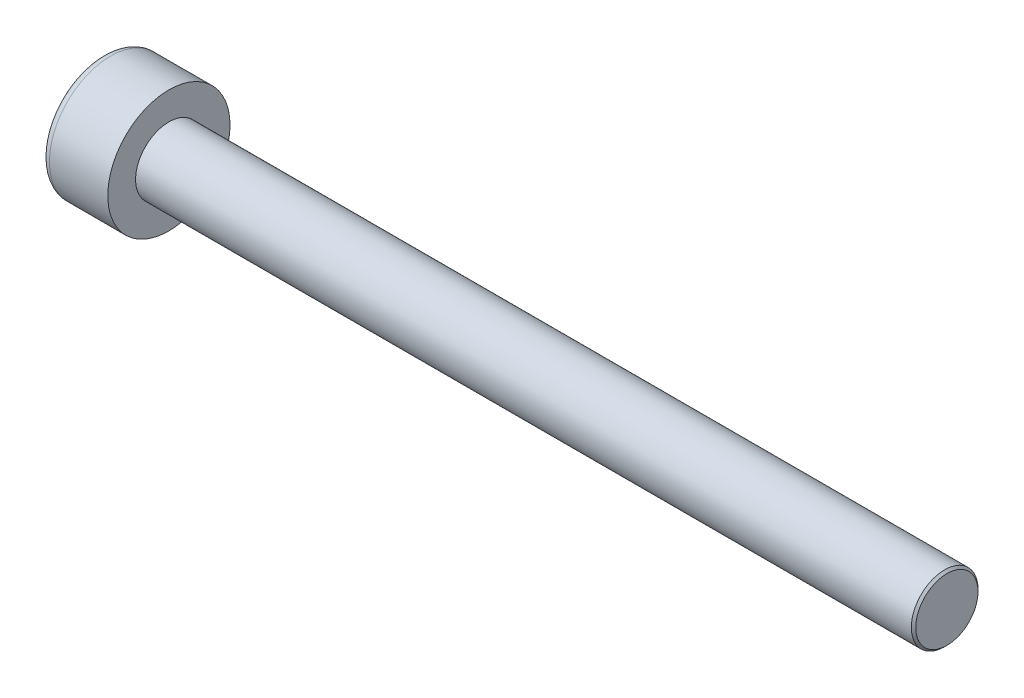
ISO-10303-21;
HEADER;
FILE_DESCRIPTION(('STEP AP214'),'2;1');
FILE_NAME('part.step','',(''),(''),'','','');
FILE_SCHEMA(('AUTOMOTIVE_DESIGN { 1 0 10303 214 1 1 1 1 }'));
ENDSEC;
DATA;
#1=APPLICATION_CONTEXT('core data for automotive mechanical design processes');
#2=APPLICATION_PROTOCOL_DEFINITION('international standard','automotive_design',2000,#1);
#3=PRODUCT_CONTEXT('',#1,'mechanical');
#4=PRODUCT('Part','Part','',(#3));
#5=PRODUCT_RELATED_PRODUCT_CATEGORY('part','',(#4));
#6=PRODUCT_DEFINITION_FORMATION('','',#4);
#7=PRODUCT_DEFINITION_CONTEXT('part definition',#1,'design');
#8=PRODUCT_DEFINITION('design','',#6,#7);
#9=PRODUCT_DEFINITION_SHAPE('','',#8);
#10=(LENGTH_UNIT() NAMED_UNIT(*) SI_UNIT(.MILLI.,.METRE.));
#11=(NAMED_UNIT(*) PLANE_ANGLE_UNIT() SI_UNIT($,.RADIAN.));
#12=(NAMED_UNIT(*) SI_UNIT($,.STERADIAN.) SOLID_ANGLE_UNIT());
#13=UNCERTAINTY_MEASURE_WITH_UNIT(LENGTH_MEASURE(1.E-05),#10,'distance_accuracy_value','');
#14=(GEOMETRIC_REPRESENTATION_CONTEXT(3) GLOBAL_UNCERTAINTY_ASSIGNED_CONTEXT((#13)) GLOBAL_UNIT_ASSIGNED_CONTEXT((#10,
#11,#12)) REPRESENTATION_CONTEXT('',''));
#15=CARTESIAN_POINT('',(0.,0.,0.));
#16=DIRECTION('',(0.,0.,1.));
#17=DIRECTION('',(1.,0.,0.));
#18=AXIS2_PLACEMENT_3D('',#15,#16,#17);
#19=CARTESIAN_POINT('',(1.3,-1.25,0.721687836487031));
#20=DIRECTION('',(0.,1.,0.));
#21=DIRECTION('',(1.,0.,0.));
#22=AXIS2_PLACEMENT_3D('',#19,#20,#21);
#23=PLANE('',#22);
#24=DIRECTION('',(0.,0.,-1.));
#25=VECTOR('',#24,1.);
#26=CARTESIAN_POINT('',(0.,-1.25,0.721687836487031));
#27=LINE('',#26,#25);
#28=CARTESIAN_POINT('',(0.,-1.25,0.721687836487031));
#29=VERTEX_POINT('',#28);
#30=CARTESIAN_POINT('',(0.,-1.25,-0.721687836487035));
#31=VERTEX_POINT('',#30);
#32=EDGE_CURVE('E150',#29,#31,#27,.T.);
#33=ORIENTED_EDGE('',*,*,#32,.F.);
#34=DIRECTION('',(-1.,0.,0.));
#35=VECTOR('',#34,1.);
#36=CARTESIAN_POINT('',(1.3,-1.25,0.721687836487031));
#37=LINE('',#36,#35);
#38=CARTESIAN_POINT('',(1.3,-1.25,0.721687836487031));
#39=VERTEX_POINT('',#38);
#40=EDGE_CURVE('E11',#39,#29,#37,.T.);
#41=ORIENTED_EDGE('',*,*,#40,.F.);
#42=DIRECTION('',(0.,0.,-1.));
#43=VECTOR('',#42,1.);
#44=CARTESIAN_POINT('',(1.3,-1.25,0.721687836487031));
#45=LINE('',#44,#43);
#46=CARTESIAN_POINT('',(1.3,-1.25,0.));
#47=VERTEX_POINT('',#46);
#48=EDGE_CURVE('E173',#39,#47,#45,.T.);
#49=ORIENTED_EDGE('',*,*,#48,.T.);
#50=DIRECTION('',(0.,0.,-1.));
#51=VECTOR('',#50,1.);
#52=CARTESIAN_POINT('',(1.3,-1.25,0.721687836487031));
#53=LINE('',#52,#51);
#54=CARTESIAN_POINT('',(1.3,-1.25,-0.721687836487035));
#55=VERTEX_POINT('',#54);
#56=EDGE_CURVE('E21',#47,#55,#53,.T.);
#57=ORIENTED_EDGE('',*,*,#56,.T.);
#58=DIRECTION('',(-1.,0.,0.));
#59=VECTOR('',#58,1.);
#60=CARTESIAN_POINT('',(1.3,-1.25,-0.721687836487035));
#61=LINE('',#60,#59);
#62=EDGE_CURVE('E135',#55,#31,#61,.T.);
#63=ORIENTED_EDGE('',*,*,#62,.T.);
#64=EDGE_LOOP('',(#33,#41,#49,#57,#63));
#65=FACE_BOUND('',#64,.T.);
#66=ADVANCED_FACE('F17',(#65),#23,.T.);
#67=CARTESIAN_POINT('',(1.3,0.,1.44337567297406));
#68=DIRECTION('',(0.,0.5,-0.866025403784439));
#69=DIRECTION('',(-1.,0.,0.));
#70=AXIS2_PLACEMENT_3D('',#67,#68,#69);
#71=PLANE('',#70);
#72=DIRECTION('',(0.,-0.866025403784439,-0.5));
#73=VECTOR('',#72,1.);
#74=CARTESIAN_POINT('',(0.,0.,1.44337567297406));
#75=LINE('',#74,#73);
#76=CARTESIAN_POINT('',(0.,0.,1.44337567297406));
#77=VERTEX_POINT('',#76);
#78=EDGE_CURVE('E169',#77,#29,#75,.T.);
#79=ORIENTED_EDGE('',*,*,#78,.F.);
#80=DIRECTION('',(-1.,0.,0.));
#81=VECTOR('',#80,1.);
#82=CARTESIAN_POINT('',(1.3,0.,1.44337567297406));
#83=LINE('',#82,#81);
#84=CARTESIAN_POINT('',(1.3,0.,1.44337567297406));
#85=VERTEX_POINT('',#84);
#86=EDGE_CURVE('E28',#85,#77,#83,.T.);
#87=ORIENTED_EDGE('',*,*,#86,.F.);
#88=DIRECTION('',(0.,-0.866025403784439,-0.5));
#89=VECTOR('',#88,1.);
#90=CARTESIAN_POINT('',(1.3,0.,1.44337567297406));
#91=LINE('',#90,#89);
#92=CARTESIAN_POINT('',(1.3,-0.625,1.08253175473055));
#93=VERTEX_POINT('',#92);
#94=EDGE_CURVE('E152',#85,#93,#91,.T.);
#95=ORIENTED_EDGE('',*,*,#94,.T.);
#96=DIRECTION('',(0.,-0.866025403784439,-0.5));
#97=VECTOR('',#96,1.);
#98=CARTESIAN_POINT('',(1.3,0.,1.44337567297406));
#99=LINE('',#98,#97);
#100=EDGE_CURVE('E177',#93,#39,#99,.T.);
#101=ORIENTED_EDGE('',*,*,#100,.T.);
#102=ORIENTED_EDGE('',*,*,#40,.T.);
#103=EDGE_LOOP('',(#79,#87,#95,#101,#102));
#104=FACE_BOUND('',#103,.T.);
#105=ADVANCED_FACE('F260',(#104),#71,.T.);
#106=CARTESIAN_POINT('',(1.3,1.25,0.721687836487032));
#107=DIRECTION('',(0.,-0.5,-0.866025403784439));
#108=DIRECTION('',(0.,-0.866025403784439,0.5));
#109=AXIS2_PLACEMENT_3D('',#106,#107,#108);
#110=PLANE('',#109);
#111=DIRECTION('',(0.,-0.866025403784439,0.5));
#112=VECTOR('',#111,1.);
#113=CARTESIAN_POINT('',(0.,1.25,0.721687836487032));
#114=LINE('',#113,#112);
#115=CARTESIAN_POINT('',(0.,1.25,0.721687836487032));
#116=VERTEX_POINT('',#115);
#117=EDGE_CURVE('E172',#116,#77,#114,.T.);
#118=ORIENTED_EDGE('',*,*,#117,.F.);
#119=DIRECTION('',(-1.,0.,0.));
#120=VECTOR('',#119,1.);
#121=CARTESIAN_POINT('',(1.3,1.25,0.721687836487032));
#122=LINE('',#121,#120);
#123=CARTESIAN_POINT('',(1.3,1.25,0.721687836487032));
#124=VERTEX_POINT('',#123);
#125=EDGE_CURVE('E211',#124,#116,#122,.T.);
#126=ORIENTED_EDGE('',*,*,#125,.F.);
#127=DIRECTION('',(0.,-0.866025403784439,0.5));
#128=VECTOR('',#127,1.);
#129=CARTESIAN_POINT('',(1.3,1.25,0.721687836487032));
#130=LINE('',#129,#128);
#131=CARTESIAN_POINT('',(1.3,0.625,1.08253175473055));
#132=VERTEX_POINT('',#131);
#133=EDGE_CURVE('E232',#124,#132,#130,.T.);
#134=ORIENTED_EDGE('',*,*,#133,.T.);
#135=DIRECTION('',(0.,-0.866025403784439,0.5));
#136=VECTOR('',#135,1.);
#137=CARTESIAN_POINT('',(1.3,1.25,0.721687836487032));
#138=LINE('',#137,#136);
#139=EDGE_CURVE('E159',#132,#85,#138,.T.);
#140=ORIENTED_EDGE('',*,*,#139,.T.);
#141=ORIENTED_EDGE('',*,*,#86,.T.);
#142=EDGE_LOOP('',(#118,#126,#134,#140,#141));
#143=FACE_BOUND('',#142,.T.);
#144=ADVANCED_FACE('F266',(#143),#110,.T.);
#145=CARTESIAN_POINT('',(1.3,1.25,-0.721687836487031));
#146=DIRECTION('',(0.,-1.,0.));
#147=DIRECTION('',(0.,0.,-1.));
#148=AXIS2_PLACEMENT_3D('',#145,#146,#147);
#149=PLANE('',#148);
#150=DIRECTION('',(0.,0.,1.));
#151=VECTOR('',#150,1.);
#152=CARTESIAN_POINT('',(0.,1.25,-0.721687836487031));
#153=LINE('',#152,#151);
#154=CARTESIAN_POINT('',(0.,1.25,-0.721687836487031));
#155=VERTEX_POINT('',#154);
#156=EDGE_CURVE('E144',#155,#116,#153,.T.);
#157=ORIENTED_EDGE('',*,*,#156,.F.);
#158=DIRECTION('',(-1.,0.,0.));
#159=VECTOR('',#158,1.);
#160=CARTESIAN_POINT('',(1.3,1.25,-0.721687836487031));
#161=LINE('',#160,#159);
#162=CARTESIAN_POINT('',(1.3,1.25,-0.721687836487031));
#163=VERTEX_POINT('',#162);
#164=EDGE_CURVE('E134',#163,#155,#161,.T.);
#165=ORIENTED_EDGE('',*,*,#164,.F.);
#166=DIRECTION('',(0.,0.,1.));
#167=VECTOR('',#166,1.);
#168=CARTESIAN_POINT('',(1.3,1.25,-0.721687836487031));
#169=LINE('',#168,#167);
#170=CARTESIAN_POINT('',(1.3,1.25,0.));
#171=VERTEX_POINT('',#170);
#172=EDGE_CURVE('E226',#163,#171,#169,.T.);
#173=ORIENTED_EDGE('',*,*,#172,.T.);
#174=DIRECTION('',(0.,0.,1.));
#175=VECTOR('',#174,1.);
#176=CARTESIAN_POINT('',(1.3,1.25,-0.721687836487031));
#177=LINE('',#176,#175);
#178=EDGE_CURVE('E113',#171,#124,#177,.T.);
#179=ORIENTED_EDGE('',*,*,#178,.T.);
#180=ORIENTED_EDGE('',*,*,#125,.T.);
#181=EDGE_LOOP('',(#157,#165,#173,#179,#180));
#182=FACE_BOUND('',#181,.T.);
#183=ADVANCED_FACE('F367',(#182),#149,.T.);
#184=CARTESIAN_POINT('',(1.3,0.,-1.44337567297406));
#185=DIRECTION('',(0.,-0.5,0.866025403784439));
#186=DIRECTION('',(-1.,0.,0.));
#187=AXIS2_PLACEMENT_3D('',#184,#185,#186);
#188=PLANE('',#187);
#189=DIRECTION('',(0.,0.866025403784439,0.5));
#190=VECTOR('',#189,1.);
#191=CARTESIAN_POINT('',(0.,0.,-1.44337567297406));
#192=LINE('',#191,#190);
#193=CARTESIAN_POINT('',(0.,0.,-1.44337567297406));
#194=VERTEX_POINT('',#193);
#195=EDGE_CURVE('E138',#194,#155,#192,.T.);
#196=ORIENTED_EDGE('',*,*,#195,.F.);
#197=DIRECTION('',(-1.,0.,0.));
#198=VECTOR('',#197,1.);
#199=CARTESIAN_POINT('',(1.3,0.,-1.44337567297406));
#200=LINE('',#199,#198);
#201=CARTESIAN_POINT('',(1.3,0.,-1.44337567297406));
#202=VERTEX_POINT('',#201);
#203=EDGE_CURVE('E122',#202,#194,#200,.T.);
#204=ORIENTED_EDGE('',*,*,#203,.F.);
#205=DIRECTION('',(0.,0.866025403784439,0.5));
#206=VECTOR('',#205,1.);
#207=CARTESIAN_POINT('',(1.3,0.,-1.44337567297406));
#208=LINE('',#207,#206);
#209=CARTESIAN_POINT('',(1.3,0.625,-1.08253175473055));
#210=VERTEX_POINT('',#209);
#211=EDGE_CURVE('E216',#202,#210,#208,.T.);
#212=ORIENTED_EDGE('',*,*,#211,.T.);
#213=DIRECTION('',(0.,0.866025403784439,0.5));
#214=VECTOR('',#213,1.);
#215=CARTESIAN_POINT('',(1.3,0.,-1.44337567297406));
#216=LINE('',#215,#214);
#217=EDGE_CURVE('E102',#210,#163,#216,.T.);
#218=ORIENTED_EDGE('',*,*,#217,.T.);
#219=ORIENTED_EDGE('',*,*,#164,.T.);
#220=EDGE_LOOP('',(#196,#204,#212,#218,#219));
#221=FACE_BOUND('',#220,.T.);
#222=ADVANCED_FACE('F139',(#221),#188,.T.);
#223=CARTESIAN_POINT('',(1.3,-1.25,-0.721687836487035));
#224=DIRECTION('',(0.,0.5,0.866025403784439));
#225=DIRECTION('',(1.,0.,0.));
#226=AXIS2_PLACEMENT_3D('',#223,#224,#225);
#227=PLANE('',#226);
#228=DIRECTION('',(0.,0.866025403784439,-0.5));
#229=VECTOR('',#228,1.);
#230=CARTESIAN_POINT('',(0.,-1.25,-0.721687836487035));
#231=LINE('',#230,#229);
#232=EDGE_CURVE('E127',#31,#194,#231,.T.);
#233=ORIENTED_EDGE('',*,*,#232,.F.);
#234=ORIENTED_EDGE('',*,*,#62,.F.);
#235=DIRECTION('',(0.,0.866025403784439,-0.5));
#236=VECTOR('',#235,1.);
#237=CARTESIAN_POINT('',(1.3,-1.25,-0.721687836487035));
#238=LINE('',#237,#236);
#239=CARTESIAN_POINT('',(1.3,-0.625,-1.08253175473055));
#240=VERTEX_POINT('',#239);
#241=EDGE_CURVE('E319',#55,#240,#238,.T.);
#242=ORIENTED_EDGE('',*,*,#241,.T.);
#243=DIRECTION('',(0.,0.866025403784439,-0.5));
#244=VECTOR('',#243,1.);
#245=CARTESIAN_POINT('',(1.3,-1.25,-0.721687836487035));
#246=LINE('',#245,#244);
#247=EDGE_CURVE('E130',#240,#202,#246,.T.);
#248=ORIENTED_EDGE('',*,*,#247,.T.);
#249=ORIENTED_EDGE('',*,*,#203,.T.);
#250=EDGE_LOOP('',(#233,#234,#242,#248,#249));
#251=FACE_BOUND('',#250,.T.);
#252=ADVANCED_FACE('F124',(#251),#227,.T.);
#253=CARTESIAN_POINT('',(38.,0.,0.));
#254=DIRECTION('',(1.,0.,0.));
#255=DIRECTION('',(0.,1.,0.));
#256=AXIS2_PLACEMENT_3D('',#253,#254,#255);
#257=PLANE('',#256);
#258=CARTESIAN_POINT('',(38.,0.,0.));
#259=DIRECTION('',(1.,0.,0.));
#260=DIRECTION('',(0.,0.,-1.));
#261=AXIS2_PLACEMENT_3D('',#258,#259,#260);
#262=CIRCLE('',#261,1.4);
#263=CARTESIAN_POINT('',(38.,0.,-1.4));
#264=VERTEX_POINT('',#263);
#265=EDGE_CURVE('E212',#264,#264,#262,.T.);
#266=ORIENTED_EDGE('',*,*,#265,.T.);
#267=EDGE_LOOP('',(#266));
#268=FACE_BOUND('',#267,.T.);
#269=ADVANCED_FACE('F19',(#268),#257,.T.);
#270=CARTESIAN_POINT('',(3.,0.,0.));
#271=DIRECTION('',(1.,0.,0.));
#272=DIRECTION('',(0.,1.,0.));
#273=AXIS2_PLACEMENT_3D('',#270,#271,#272);
#274=PLANE('',#273);
#275=CARTESIAN_POINT('',(3.,0.,0.));
#276=DIRECTION('',(1.,0.,0.));
#277=DIRECTION('',(0.,0.,-1.));
#278=AXIS2_PLACEMENT_3D('',#275,#276,#277);
#279=CIRCLE('',#278,1.5);
#280=CARTESIAN_POINT('',(3.,0.,-1.5));
#281=VERTEX_POINT('',#280);
#282=EDGE_CURVE('E225',#281,#281,#279,.T.);
#283=ORIENTED_EDGE('',*,*,#282,.F.);
#284=EDGE_LOOP('',(#283));
#285=FACE_BOUND('',#284,.T.);
#286=CARTESIAN_POINT('',(3.,0.,0.));
#287=DIRECTION('',(1.,0.,0.));
#288=DIRECTION('',(0.,0.,-1.));
#289=AXIS2_PLACEMENT_3D('',#286,#287,#288);
#290=CIRCLE('',#289,2.75);
#291=CARTESIAN_POINT('',(3.,0.,-2.75));
#292=VERTEX_POINT('',#291);
#293=EDGE_CURVE('E186',#292,#292,#290,.T.);
#294=ORIENTED_EDGE('',*,*,#293,.T.);
#295=EDGE_LOOP('',(#294));
#296=FACE_BOUND('',#295,.T.);
#297=ADVANCED_FACE('F270',(#285,#296),#274,.T.);
#298=CARTESIAN_POINT('',(0.,0.,0.));
#299=DIRECTION('',(1.,0.,0.));
#300=DIRECTION('',(0.,1.,0.));
#301=AXIS2_PLACEMENT_3D('',#298,#299,#300);
#302=PLANE('',#301);
#303=ORIENTED_EDGE('',*,*,#232,.T.);
#304=ORIENTED_EDGE('',*,*,#195,.T.);
#305=ORIENTED_EDGE('',*,*,#156,.T.);
#306=ORIENTED_EDGE('',*,*,#117,.T.);
#307=ORIENTED_EDGE('',*,*,#78,.T.);
#308=ORIENTED_EDGE('',*,*,#32,.T.);
#309=EDGE_LOOP('',(#303,#304,#305,#306,#307,#308));
#310=FACE_BOUND('',#309,.T.);
#311=CARTESIAN_POINT('',(0.,0.,0.));
#312=DIRECTION('',(-1.,0.,0.));
#313=DIRECTION('',(0.,0.,-1.));
#314=AXIS2_PLACEMENT_3D('',#311,#312,#313);
#315=CIRCLE('',#314,2.375);
#316=CARTESIAN_POINT('',(0.,0.,2.375));
#317=VERTEX_POINT('',#316);
#318=EDGE_CURVE('E168',#317,#317,#315,.T.);
#319=ORIENTED_EDGE('',*,*,#318,.T.);
#320=EDGE_LOOP('',(#319));
#321=FACE_BOUND('',#320,.T.);
#322=ADVANCED_FACE('F147',(#310,#321),#302,.F.);
#323=CARTESIAN_POINT('',(1.3,-2.5,0.));
#324=DIRECTION('',(-1.,0.,0.));
#325=DIRECTION('',(0.,0.,1.));
#326=AXIS2_PLACEMENT_3D('',#323,#324,#325);
#327=PLANE('',#326);
#328=ORIENTED_EDGE('',*,*,#139,.F.);
#329=CARTESIAN_POINT('',(1.3,0.,0.));
#330=DIRECTION('',(1.,0.,0.));
#331=DIRECTION('',(0.,0.,1.));
#332=AXIS2_PLACEMENT_3D('',#329,#330,#331);
#333=CIRCLE('',#332,1.25);
#334=EDGE_CURVE('E305',#132,#93,#333,.T.);
#335=ORIENTED_EDGE('',*,*,#334,.T.);
#336=ORIENTED_EDGE('',*,*,#94,.F.);
#337=EDGE_LOOP('',(#328,#335,#336));
#338=FACE_BOUND('',#337,.T.);
#339=ADVANCED_FACE('F255',(#338),#327,.T.);
#340=CARTESIAN_POINT('',(1.3,-2.5,0.));
#341=DIRECTION('',(-1.,0.,0.));
#342=DIRECTION('',(0.,0.,1.));
#343=AXIS2_PLACEMENT_3D('',#340,#341,#342);
#344=PLANE('',#343);
#345=ORIENTED_EDGE('',*,*,#178,.F.);
#346=CARTESIAN_POINT('',(1.3,0.,0.));
#347=DIRECTION('',(1.,0.,0.));
#348=DIRECTION('',(0.,0.,1.));
#349=AXIS2_PLACEMENT_3D('',#346,#347,#348);
#350=CIRCLE('',#349,1.25);
#351=EDGE_CURVE('E208',#171,#132,#350,.T.);
#352=ORIENTED_EDGE('',*,*,#351,.T.);
#353=ORIENTED_EDGE('',*,*,#133,.F.);
#354=EDGE_LOOP('',(#345,#352,#353));
#355=FACE_BOUND('',#354,.T.);
#356=ADVANCED_FACE('F247',(#355),#344,.T.);
#357=CARTESIAN_POINT('',(1.3,-2.5,0.));
#358=DIRECTION('',(-1.,0.,0.));
#359=DIRECTION('',(0.,0.,1.));
#360=AXIS2_PLACEMENT_3D('',#357,#358,#359);
#361=PLANE('',#360);
#362=ORIENTED_EDGE('',*,*,#217,.F.);
#363=CARTESIAN_POINT('',(1.3,0.,0.));
#364=DIRECTION('',(1.,0.,0.));
#365=DIRECTION('',(0.,0.,-1.));
#366=AXIS2_PLACEMENT_3D('',#363,#364,#365);
#367=CIRCLE('',#366,1.25);
#368=EDGE_CURVE('E204',#210,#171,#367,.T.);
#369=ORIENTED_EDGE('',*,*,#368,.T.);
#370=ORIENTED_EDGE('',*,*,#172,.F.);
#371=EDGE_LOOP('',(#362,#369,#370));
#372=FACE_BOUND('',#371,.T.);
#373=ADVANCED_FACE('F245',(#372),#361,.T.);
#374=CARTESIAN_POINT('',(1.3,-2.5,0.));
#375=DIRECTION('',(-1.,0.,0.));
#376=DIRECTION('',(0.,0.,1.));
#377=AXIS2_PLACEMENT_3D('',#374,#375,#376);
#378=PLANE('',#377);
#379=ORIENTED_EDGE('',*,*,#247,.F.);
#380=CARTESIAN_POINT('',(1.3,0.,0.));
#381=DIRECTION('',(1.,0.,0.));
#382=DIRECTION('',(0.,0.,1.));
#383=AXIS2_PLACEMENT_3D('',#380,#381,#382);
#384=CIRCLE('',#383,1.25);
#385=CARTESIAN_POINT('',(1.3,0.,-1.25));
#386=VERTEX_POINT('',#385);
#387=EDGE_CURVE('E167',#240,#386,#384,.T.);
#388=ORIENTED_EDGE('',*,*,#387,.T.);
#389=CARTESIAN_POINT('',(1.3,0.,0.));
#390=DIRECTION('',(1.,0.,0.));
#391=DIRECTION('',(0.,0.,1.));
#392=AXIS2_PLACEMENT_3D('',#389,#390,#391);
#393=CIRCLE('',#392,1.25);
#394=EDGE_CURVE('E207',#386,#210,#393,.T.);
#395=ORIENTED_EDGE('',*,*,#394,.T.);
#396=ORIENTED_EDGE('',*,*,#211,.F.);
#397=EDGE_LOOP('',(#379,#388,#395,#396));
#398=FACE_BOUND('',#397,.T.);
#399=ADVANCED_FACE('F238',(#398),#378,.T.);
#400=CARTESIAN_POINT('',(1.3,-2.5,0.));
#401=DIRECTION('',(-1.,0.,0.));
#402=DIRECTION('',(0.,0.,1.));
#403=AXIS2_PLACEMENT_3D('',#400,#401,#402);
#404=PLANE('',#403);
#405=ORIENTED_EDGE('',*,*,#56,.F.);
#406=CARTESIAN_POINT('',(1.3,0.,0.));
#407=DIRECTION('',(1.,0.,0.));
#408=DIRECTION('',(0.,0.,1.));
#409=AXIS2_PLACEMENT_3D('',#406,#407,#408);
#410=CIRCLE('',#409,1.25);
#411=EDGE_CURVE('E222',#47,#240,#410,.T.);
#412=ORIENTED_EDGE('',*,*,#411,.T.);
#413=ORIENTED_EDGE('',*,*,#241,.F.);
#414=EDGE_LOOP('',(#405,#412,#413));
#415=FACE_BOUND('',#414,.T.);
#416=ADVANCED_FACE('F254',(#415),#404,.T.);
#417=CARTESIAN_POINT('',(1.3,-2.5,0.));
#418=DIRECTION('',(-1.,0.,0.));
#419=DIRECTION('',(0.,0.,1.));
#420=AXIS2_PLACEMENT_3D('',#417,#418,#419);
#421=PLANE('',#420);
#422=ORIENTED_EDGE('',*,*,#100,.F.);
#423=CARTESIAN_POINT('',(1.3,0.,0.));
#424=DIRECTION('',(1.,0.,0.));
#425=DIRECTION('',(0.,0.,1.));
#426=AXIS2_PLACEMENT_3D('',#423,#424,#425);
#427=CIRCLE('',#426,1.25);
#428=EDGE_CURVE('E299',#93,#47,#427,.T.);
#429=ORIENTED_EDGE('',*,*,#428,.T.);
#430=ORIENTED_EDGE('',*,*,#48,.F.);
#431=EDGE_LOOP('',(#422,#429,#430));
#432=FACE_BOUND('',#431,.T.);
#433=ADVANCED_FACE('F283',(#432),#421,.T.);
#434=CARTESIAN_POINT('',(3.,0.,0.));
#435=DIRECTION('',(-1.,0.,0.));
#436=DIRECTION('',(0.,0.,1.));
#437=AXIS2_PLACEMENT_3D('',#434,#435,#436);
#438=CYLINDRICAL_SURFACE('',#437,2.75);
#439=CARTESIAN_POINT('',(0.375,0.,0.));
#440=DIRECTION('',(1.,0.,0.));
#441=DIRECTION('',(0.,0.,-1.));
#442=AXIS2_PLACEMENT_3D('',#439,#440,#441);
#443=CIRCLE('',#442,2.75);
#444=CARTESIAN_POINT('',(0.375,0.,-2.75));
#445=VERTEX_POINT('',#444);
#446=CARTESIAN_POINT('',(0.375,0.,2.75));
#447=VERTEX_POINT('',#446);
#448=EDGE_CURVE('E183',#445,#447,#443,.T.);
#449=ORIENTED_EDGE('',*,*,#448,.T.);
#450=CARTESIAN_POINT('',(0.375,0.,0.));
#451=DIRECTION('',(1.,0.,0.));
#452=DIRECTION('',(0.,0.,-1.));
#453=AXIS2_PLACEMENT_3D('',#450,#451,#452);
#454=CIRCLE('',#453,2.75);
#455=EDGE_CURVE('E178',#447,#445,#454,.T.);
#456=ORIENTED_EDGE('',*,*,#455,.T.);
#457=DIRECTION('',(1.,0.,0.));
#458=VECTOR('',#457,1.);
#459=CARTESIAN_POINT('',(3.,0.,-2.75));
#460=LINE('',#459,#458);
#461=EDGE_CURVE('E192',#445,#292,#460,.T.);
#462=ORIENTED_EDGE('',*,*,#461,.T.);
#463=ORIENTED_EDGE('',*,*,#293,.F.);
#464=ORIENTED_EDGE('',*,*,#461,.F.);
#465=EDGE_LOOP('',(#449,#456,#462,#463,#464));
#466=FACE_BOUND('',#465,.T.);
#467=ADVANCED_FACE('F281',(#466),#438,.T.);
#468=CARTESIAN_POINT('',(11.,0.,0.));
#469=DIRECTION('',(-1.,0.,0.));
#470=DIRECTION('',(0.,0.,1.));
#471=AXIS2_PLACEMENT_3D('',#468,#469,#470);
#472=CYLINDRICAL_SURFACE('',#471,1.5);
#473=ORIENTED_EDGE('',*,*,#282,.T.);
#474=DIRECTION('',(1.,0.,0.));
#475=VECTOR('',#474,1.);
#476=CARTESIAN_POINT('',(11.,0.,-1.5));
#477=LINE('',#476,#475);
#478=CARTESIAN_POINT('',(37.9,0.,-1.5));
#479=VERTEX_POINT('',#478);
#480=EDGE_CURVE('E196',#281,#479,#477,.T.);
#481=ORIENTED_EDGE('',*,*,#480,.T.);
#482=CARTESIAN_POINT('',(37.9,0.,0.));
#483=DIRECTION('',(-1.,0.,0.));
#484=DIRECTION('',(0.,0.,-1.));
#485=AXIS2_PLACEMENT_3D('',#482,#483,#484);
#486=CIRCLE('',#485,1.5);
#487=EDGE_CURVE('E187',#479,#479,#486,.T.);
#488=ORIENTED_EDGE('',*,*,#487,.T.);
#489=ORIENTED_EDGE('',*,*,#480,.F.);
#490=EDGE_LOOP('',(#473,#481,#488,#489));
#491=FACE_BOUND('',#490,.T.);
#492=ADVANCED_FACE('F279',(#491),#472,.T.);
#493=CARTESIAN_POINT('',(1.3,0.,0.));
#494=DIRECTION('',(-1.,0.,0.));
#495=DIRECTION('',(0.,0.,1.));
#496=AXIS2_PLACEMENT_3D('',#493,#494,#495);
#497=CONICAL_SURFACE('',#496,1.25,1.0471975511966);
#498=DIRECTION('',(-0.5,0.,-0.866025403784438));
#499=VECTOR('',#498,1.);
#500=CARTESIAN_POINT('',(1.3,0.,-1.25));
#501=LINE('',#500,#499);
#502=CARTESIAN_POINT('',(2.02168783648704,0.,0.));
#503=VERTEX_POINT('',#502);
#504=EDGE_CURVE('E164',#503,#386,#501,.T.);
#505=ORIENTED_EDGE('',*,*,#504,.T.);
#506=ORIENTED_EDGE('',*,*,#387,.F.);
#507=ORIENTED_EDGE('',*,*,#411,.F.);
#508=ORIENTED_EDGE('',*,*,#428,.F.);
#509=ORIENTED_EDGE('',*,*,#334,.F.);
#510=ORIENTED_EDGE('',*,*,#351,.F.);
#511=ORIENTED_EDGE('',*,*,#368,.F.);
#512=ORIENTED_EDGE('',*,*,#394,.F.);
#513=ORIENTED_EDGE('',*,*,#504,.F.);
#514=EDGE_LOOP('',(#505,#506,#507,#508,#509,#510,#511,#512,#513));
#515=FACE_BOUND('',#514,.T.);
#516=ADVANCED_FACE('F243',(#515),#497,.F.);
#517=CARTESIAN_POINT('',(0.375,0.,0.));
#518=DIRECTION('',(1.,0.,0.));
#519=DIRECTION('',(0.,0.,-1.));
#520=AXIS2_PLACEMENT_3D('',#517,#518,#519);
#521=TOROIDAL_SURFACE('',#520,2.375,0.375);
#522=ORIENTED_EDGE('',*,*,#448,.F.);
#523=ORIENTED_EDGE('',*,*,#455,.F.);
#524=CARTESIAN_POINT('',(0.375,0.,2.375));
#525=DIRECTION('',(0.,-1.,0.));
#526=DIRECTION('',(0.,0.,1.));
#527=AXIS2_PLACEMENT_3D('',#524,#525,#526);
#528=CIRCLE('',#527,0.375);
#529=EDGE_CURVE('E182',#447,#317,#528,.T.);
#530=ORIENTED_EDGE('',*,*,#529,.T.);
#531=ORIENTED_EDGE('',*,*,#318,.F.);
#532=ORIENTED_EDGE('',*,*,#529,.F.);
#533=EDGE_LOOP('',(#522,#523,#530,#531,#532));
#534=FACE_BOUND('',#533,.T.);
#535=ADVANCED_FACE('F277',(#534),#521,.T.);
#536=CARTESIAN_POINT('',(38.,0.,0.));
#537=DIRECTION('',(-1.,0.,0.));
#538=DIRECTION('',(0.,0.,1.));
#539=AXIS2_PLACEMENT_3D('',#536,#537,#538);
#540=CONICAL_SURFACE('',#539,1.4,0.785398163397452);
#541=ORIENTED_EDGE('',*,*,#487,.F.);
#542=DIRECTION('',(0.707106781186545,0.,0.70710678118655));
#543=VECTOR('',#542,1.);
#544=CARTESIAN_POINT('',(38.,0.,-1.4));
#545=LINE('',#544,#543);
#546=EDGE_CURVE('E190',#479,#264,#545,.T.);
#547=ORIENTED_EDGE('',*,*,#546,.T.);
#548=ORIENTED_EDGE('',*,*,#265,.F.);
#549=ORIENTED_EDGE('',*,*,#546,.F.);
#550=EDGE_LOOP('',(#541,#547,#548,#549));
#551=FACE_BOUND('',#550,.T.);
#552=ADVANCED_FACE('F274',(#551),#540,.T.);
#553=CLOSED_SHELL('',(#66,#105,#144,#183,#222,#252,#269,#297,#322,#339,#356,#373,#399,#416,#433,
#467,#492,#516,#535,#552));
#554=MANIFOLD_SOLID_BREP('B1',#553);
#555=ADVANCED_BREP_SHAPE_REPRESENTATION('',(#18,#554),#14);
#556=SHAPE_DEFINITION_REPRESENTATION(#9,#555);
ENDSEC;
END-ISO-10303-21;
